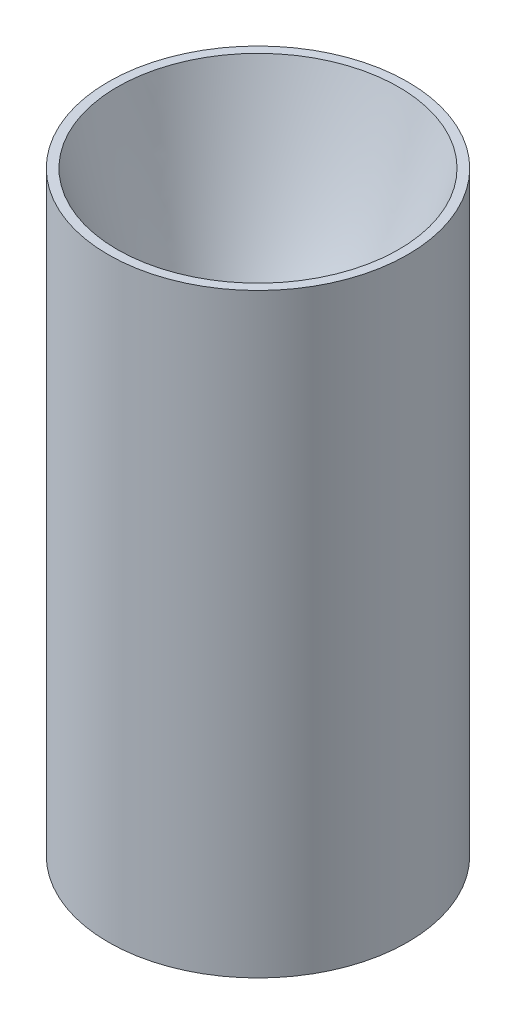
ISO-10303-21;
HEADER;
FILE_DESCRIPTION(('STEP AP214'),'2;1');
FILE_NAME('part.step','',(''),(''),'','','');
FILE_SCHEMA(('AUTOMOTIVE_DESIGN { 1 0 10303 214 1 1 1 1 }'));
ENDSEC;
DATA;
#1=APPLICATION_CONTEXT('core data for automotive mechanical design processes');
#2=APPLICATION_PROTOCOL_DEFINITION('international standard','automotive_design',2000,#1);
#3=PRODUCT_CONTEXT('',#1,'mechanical');
#4=PRODUCT('Part','Part','',(#3));
#5=PRODUCT_RELATED_PRODUCT_CATEGORY('part','',(#4));
#6=PRODUCT_DEFINITION_FORMATION('','',#4);
#7=PRODUCT_DEFINITION_CONTEXT('part definition',#1,'design');
#8=PRODUCT_DEFINITION('design','',#6,#7);
#9=PRODUCT_DEFINITION_SHAPE('','',#8);
#10=(LENGTH_UNIT() NAMED_UNIT(*) SI_UNIT(.MILLI.,.METRE.));
#11=(NAMED_UNIT(*) PLANE_ANGLE_UNIT() SI_UNIT($,.RADIAN.));
#12=(NAMED_UNIT(*) SI_UNIT($,.STERADIAN.) SOLID_ANGLE_UNIT());
#13=UNCERTAINTY_MEASURE_WITH_UNIT(LENGTH_MEASURE(1.E-05),#10,'distance_accuracy_value','');
#14=(GEOMETRIC_REPRESENTATION_CONTEXT(3) GLOBAL_UNCERTAINTY_ASSIGNED_CONTEXT((#13)) GLOBAL_UNIT_ASSIGNED_CONTEXT((#10,
#11,#12)) REPRESENTATION_CONTEXT('',''));
#15=CARTESIAN_POINT('',(0.,0.,0.));
#16=DIRECTION('',(0.,0.,1.));
#17=DIRECTION('',(1.,0.,0.));
#18=AXIS2_PLACEMENT_3D('',#15,#16,#17);
#19=CARTESIAN_POINT('',(26.7062113287053,6.50923965033825,0.));
#20=CARTESIAN_POINT('',(26.6554523867853,6.45847884124841,0.));
#21=CARTESIAN_POINT('',(26.5813741961518,6.38212177902064,0.));
#22=CARTESIAN_POINT('',(26.4154873738352,6.20864164611654,0.));
#23=CARTESIAN_POINT('',(26.2772778817675,6.04995163656635,0.));
#24=CARTESIAN_POINT('',(26.089808500155,5.83291364729743,0.));
#25=CARTESIAN_POINT('',(25.9153376003489,5.61072754276574,0.));
#26=CARTESIAN_POINT('',(25.7027203959471,5.32551893593357,0.));
#27=CARTESIAN_POINT('',(25.5134468469557,5.04570386122365,0.));
#28=CARTESIAN_POINT('',(25.3274206305271,4.75130157548285,0.));
#29=CARTESIAN_POINT('',(25.1569443484507,4.45478312275658,0.));
#30=CARTESIAN_POINT('',(24.995002426509,4.14928218433454,0.));
#31=CARTESIAN_POINT('',(24.8462181027666,3.83966673272222,0.));
#32=CARTESIAN_POINT('',(24.7081288971286,3.52362715719563,0.));
#33=CARTESIAN_POINT('',(24.5825511965105,3.20334704099946,0.));
#34=CARTESIAN_POINT('',(24.4686735390696,2.87809264472723,0.));
#35=CARTESIAN_POINT('',(24.3672556972351,2.54923942069524,0.));
#36=CARTESIAN_POINT('',(24.2780737272776,2.21635441997579,0.));
#37=CARTESIAN_POINT('',(24.2014758273978,1.88099677694374,0.));
#38=CARTESIAN_POINT('',(24.1374314313173,1.54205049780854,0.));
#39=CARTESIAN_POINT('',(24.0861168447955,1.20253727286862,0.));
#40=CARTESIAN_POINT('',(24.0523672130417,0.901433327840423,0.));
#41=CARTESIAN_POINT('',(24.0314657247247,0.646764266269616,0.));
#42=CARTESIAN_POINT('',(24.0193936938296,0.427064117093707,0.));
#43=CARTESIAN_POINT('',(24.0129558487222,0.267641069384235,0.));
#44=CARTESIAN_POINT('',(24.0105384573959,0.11011368951911,0.));
#45=CARTESIAN_POINT('',(24.0100006264442,0.0358926521759333,0.));
#46=CARTESIAN_POINT('',(24.01,1.20494413205813E-13,0.));
#47=B_SPLINE_CURVE_WITH_KNOTS('',4,(#19,#20,#21,#22,#23,#24,#25,#26,#27,#28,#29,#30,#31,#32,#33,
#34,#35,#36,#37,#38,#39,#40,#41,#42,#43,#44,#45,#46),.UNSPECIFIED.,.F.,.F.,(5,1,1,1,1,1,1,1,1,1,
1,1,1,1,1,1,1,1,1,1,1,1,1,1,5),(0.0825688161645696,0.122284452541055,0.142142270729318,
0.162000088917581,0.201715725294151,0.241431361670644,0.281146998047181,0.320862634423759,
0.360578270800262,0.400293907176806,0.440009543553384,0.479725179929891,0.519440816306429,
0.55915645268299,0.598872089059496,0.638587725436031,0.678303361812587,0.718018998189109,
0.75773463456565,0.797450270942201,0.837165907318734,0.857023725507005,0.876881543695275,
0.896739361883545,0.916597180071815),.UNSPECIFIED.);
#48=CARTESIAN_POINT('',(0.,0.,0.));
#49=DIRECTION('',(0.,1.,0.));
#50=AXIS1_PLACEMENT('',#48,#49);
#51=SURFACE_OF_REVOLUTION('',#47,#50);
#52=CARTESIAN_POINT('',(0.,-4.63851297595377E-09,0.));
#53=DIRECTION('',(0.,1.,0.));
#54=DIRECTION('',(0.,0.,1.));
#55=AXIS2_PLACEMENT_3D('',#52,#53,#54);
#56=CIRCLE('',#55,24.0100000000001);
#57=CARTESIAN_POINT('',(0.,-4.63851297595377E-09,24.0100000000001));
#58=VERTEX_POINT('',#57);
#59=EDGE_CURVE('E12',#58,#58,#56,.T.);
#60=ORIENTED_EDGE('',*,*,#59,.F.);
#61=EDGE_LOOP('',(#60));
#62=FACE_BOUND('',#61,.T.);
#63=CARTESIAN_POINT('',(0.,6.50923965033824,0.));
#64=DIRECTION('',(0.,1.,0.));
#65=DIRECTION('',(0.,0.,1.));
#66=AXIS2_PLACEMENT_3D('',#63,#64,#65);
#67=CIRCLE('',#66,26.7062113287053);
#68=CARTESIAN_POINT('',(0.,6.50923965033824,26.7062113287053));
#69=VERTEX_POINT('',#68);
#70=EDGE_CURVE('E132',#69,#69,#67,.T.);
#71=ORIENTED_EDGE('',*,*,#70,.T.);
#72=EDGE_LOOP('',(#71));
#73=FACE_BOUND('',#72,.T.);
#74=ADVANCED_FACE('F40',(#62,#73),#51,.T.);
#75=CARTESIAN_POINT('',(24.0100000000001,-4.63851297595377E-09,0.));
#76=CARTESIAN_POINT('',(24.0100012308879,-0.0705286471806296,0.));
#77=CARTESIAN_POINT('',(24.0105303784154,-0.213584189808399,0.));
#78=CARTESIAN_POINT('',(24.0129060644378,-0.543182916000295,0.));
#79=CARTESIAN_POINT('',(24.0192304593338,-0.824160396722382,0.));
#80=CARTESIAN_POINT('',(24.028715581354,-1.19482207162053,0.));
#81=CARTESIAN_POINT('',(24.041357874975,-1.5134350582044,0.));
#82=CARTESIAN_POINT('',(24.0571580997589,-1.86193960310249,0.));
#83=CARTESIAN_POINT('',(24.0761133590991,-2.19370687162018,0.));
#84=CARTESIAN_POINT('',(24.1037509743088,-2.6180693997322,0.));
#85=CARTESIAN_POINT('',(24.1432191823018,-3.12203394660472,0.));
#86=CARTESIAN_POINT('',(24.2142318445419,-3.87997867467877,0.));
#87=CARTESIAN_POINT('',(24.3340588184502,-4.88645038788512,0.));
#88=CARTESIAN_POINT('',(24.5104181877973,-6.05671075995822,0.));
#89=CARTESIAN_POINT('',(24.7618173808534,-7.38516641426055,0.));
#90=CARTESIAN_POINT('',(25.0627274651943,-8.70357451376833,0.));
#91=CARTESIAN_POINT('',(25.4127027791712,-10.0096372076367,0.));
#92=CARTESIAN_POINT('',(25.8112931431577,-11.3018195954144,0.));
#93=CARTESIAN_POINT('',(26.2578775553251,-12.578099333351,0.));
#94=CARTESIAN_POINT('',(26.7519354900863,-13.8368874820531,0.));
#95=CARTESIAN_POINT('',(27.2926052929641,-15.0761971264614,0.));
#96=CARTESIAN_POINT('',(27.8794115613683,-16.2946097910276,0.));
#97=CARTESIAN_POINT('',(28.5110715760484,-17.4899387906979,0.));
#98=CARTESIAN_POINT('',(29.1874645778211,-18.6612877533156,0.));
#99=CARTESIAN_POINT('',(29.9063772872839,-19.8057433922576,0.));
#100=CARTESIAN_POINT('',(30.6689541882257,-20.9238600699861,0.));
#101=CARTESIAN_POINT('',(31.3700993843039,-21.8744117549958,0.));
#102=CARTESIAN_POINT('',(31.9996683170955,-22.6734454747528,0.));
#103=CARTESIAN_POINT('',(32.5350606124484,-23.3204221321394,0.));
#104=CARTESIAN_POINT('',(32.9831879656876,-23.8400050101016,0.));
#105=CARTESIAN_POINT('',(33.4193822252076,-24.3298162395294,0.));
#106=CARTESIAN_POINT('',(33.846758321774,-24.7884843827885,0.));
#107=CARTESIAN_POINT('',(34.1564908411792,-25.1138683029968,0.));
#108=CARTESIAN_POINT('',(34.447792159871,-25.4096490394163,0.));
#109=CARTESIAN_POINT('',(34.547344628126,-25.5099499246291,0.));
#110=CARTESIAN_POINT('',(34.5972150059849,-25.5598221095879,0.));
#111=B_SPLINE_CURVE_WITH_KNOTS('',4,(#75,#76,#77,#78,#79,#80,#81,#82,#83,#84,#85,#86,#87,#88,
#89,#90,#91,#92,#93,#94,#95,#96,#97,#98,#99,#100,#101,#102,#103,#104,#105,#106,#107,#108,#109,
#110),.UNSPECIFIED.,.F.,.F.,(5,1,1,1,1,1,1,1,1,1,1,1,1,1,1,1,1,1,1,1,1,1,1,1,1,1,1,1,1,1,1,1,5),
(0.0826377293539222,0.0925749264345495,0.10251212335078,0.11244932026701,0.122386517183241,
0.132323714099471,0.142260911015702,0.152198107931932,0.162135304848163,0.182009698680624,
0.201884092513085,0.241632880178006,0.281381667842927,0.321130455507848,0.360879243172768,
0.400628030837689,0.44037681850261,0.480125606167531,0.519874393832452,0.559623181497373,
0.599371969162294,0.639120756827214,0.678869544492136,0.718618332157059,0.758367119821983,
0.798115907486907,0.817990301319368,0.837864695151829,0.857739088984291,0.877613482816753,
0.897487876649217,0.907425073565449,0.91736227031499),.UNSPECIFIED.);
#112=CARTESIAN_POINT('',(0.,0.,0.));
#113=DIRECTION('',(0.,1.,0.));
#114=AXIS1_PLACEMENT('',#112,#113);
#115=SURFACE_OF_REVOLUTION('',#111,#114);
#116=CARTESIAN_POINT('',(0.,-25.5598221063175,0.));
#117=DIRECTION('',(0.,1.,0.));
#118=DIRECTION('',(0.,0.,1.));
#119=AXIS2_PLACEMENT_3D('',#116,#117,#118);
#120=CIRCLE('',#119,34.597215002682);
#121=CARTESIAN_POINT('',(0.,-25.5598221063175,34.597215002682));
#122=VERTEX_POINT('',#121);
#123=EDGE_CURVE('E49',#122,#122,#120,.T.);
#124=ORIENTED_EDGE('',*,*,#123,.F.);
#125=EDGE_LOOP('',(#124));
#126=FACE_BOUND('',#125,.T.);
#127=ORIENTED_EDGE('',*,*,#59,.T.);
#128=EDGE_LOOP('',(#127));
#129=FACE_BOUND('',#128,.T.);
#130=ADVANCED_FACE('F146',(#126,#129),#115,.T.);
#131=CARTESIAN_POINT('',(0.,-25.5598221063175,0.));
#132=DIRECTION('',(0.,-1.,0.));
#133=DIRECTION('',(0.,0.,-1.));
#134=AXIS2_PLACEMENT_3D('',#131,#132,#133);
#135=CONICAL_SURFACE('',#134,34.597215002682,0.785398163436918);
#136=CARTESIAN_POINT('',(0.,-34.1674502939677,0.));
#137=DIRECTION('',(0.,1.,0.));
#138=DIRECTION('',(0.,0.,1.));
#139=AXIS2_PLACEMENT_3D('',#136,#137,#138);
#140=CIRCLE('',#139,43.2048431910117);
#141=CARTESIAN_POINT('',(0.,-34.1674502939677,43.2048431910117));
#142=VERTEX_POINT('',#141);
#143=EDGE_CURVE('E209',#142,#142,#140,.T.);
#144=ORIENTED_EDGE('',*,*,#143,.F.);
#145=EDGE_LOOP('',(#144));
#146=FACE_BOUND('',#145,.T.);
#147=ORIENTED_EDGE('',*,*,#123,.T.);
#148=EDGE_LOOP('',(#147));
#149=FACE_BOUND('',#148,.T.);
#150=ADVANCED_FACE('F150',(#146,#149),#135,.F.);
#151=CARTESIAN_POINT('',(43.2048431910117,-34.1674502939677,0.));
#152=CARTESIAN_POINT('',(43.2547153506856,-34.2173226920675,0.));
#153=CARTESIAN_POINT('',(43.355324273446,-34.3186769232247,0.));
#154=CARTESIAN_POINT('',(43.5850046103254,-34.5517100833776,0.));
#155=CARTESIAN_POINT('',(43.7848568308025,-34.7605007810703,0.));
#156=CARTESIAN_POINT('',(44.0923897137163,-35.0847918110198,0.));
#157=CARTESIAN_POINT('',(44.4257084053366,-35.4471532786684,0.));
#158=CARTESIAN_POINT('',(44.8260591696382,-35.8944082488335,0.));
#159=CARTESIAN_POINT('',(45.2637499086886,-36.4035418925499,0.));
#160=CARTESIAN_POINT('',(45.804470174004,-37.0558327258508,0.));
#161=CARTESIAN_POINT('',(46.4308013075469,-37.8516123801807,0.));
#162=CARTESIAN_POINT('',(47.1340343977234,-38.8042368249593,0.));
#163=CARTESIAN_POINT('',(47.8954077940367,-39.9211332329875,0.));
#164=CARTESIAN_POINT('',(48.6150575182791,-41.066315445318,0.));
#165=CARTESIAN_POINT('',(49.2910525354159,-42.2372537964432,0.));
#166=CARTESIAN_POINT('',(49.9229932483287,-43.432862075061,0.));
#167=CARTESIAN_POINT('',(50.5096660891853,-44.6511293450361,0.));
#168=CARTESIAN_POINT('',(51.0504527138448,-45.8905689397382,0.));
#169=CARTESIAN_POINT('',(51.5444702004237,-47.1492955949499,0.));
#170=CARTESIAN_POINT('',(51.935281123378,-48.266129746359,0.));
#171=CARTESIAN_POINT('',(52.2402217371782,-49.2332382589145,0.));
#172=CARTESIAN_POINT('',(52.5209466340237,-50.2076495532163,0.));
#173=CARTESIAN_POINT('',(52.777307542888,-51.1886995950363,0.));
#174=CARTESIAN_POINT('',(53.002996622536,-52.1776033299981,0.));
#175=CARTESIAN_POINT('',(53.1977432709239,-53.1725857458987,0.));
#176=CARTESIAN_POINT('',(53.3676082482091,-54.1725959341046,0.));
#177=CARTESIAN_POINT('',(53.4883593342665,-55.0083263626577,0.));
#178=CARTESIAN_POINT('',(53.5882209356748,-55.8486408667646,0.));
#179=CARTESIAN_POINT('',(53.6671256164262,-56.6881586650867,0.));
#180=CARTESIAN_POINT('',(53.7113377874485,-57.2811203984697,0.));
#181=CARTESIAN_POINT('',(53.7413501349951,-57.7817549415905,0.));
#182=CARTESIAN_POINT('',(53.7611009684533,-58.2129981204124,0.));
#183=CARTESIAN_POINT('',(53.7737438702188,-58.5327279861784,0.));
#184=CARTESIAN_POINT('',(53.7832293621914,-58.9049559910443,0.));
#185=CARTESIAN_POINT('',(53.7895539646928,-59.1817251147379,0.));
#186=CARTESIAN_POINT('',(53.7919298193635,-59.5155666011774,0.));
#187=CARTESIAN_POINT('',(53.7924589641933,-59.6571436548259,0.));
#188=CARTESIAN_POINT('',(53.7924601964689,-59.7276737080035,0.));
#189=B_SPLINE_CURVE_WITH_KNOTS('',4,(#151,#152,#153,#154,#155,#156,#157,#158,#159,#160,#161,
#162,#163,#164,#165,#166,#167,#168,#169,#170,#171,#172,#173,#174,#175,#176,#177,#178,#179,#180,
#181,#182,#183,#184,#185,#186,#187,#188),.UNSPECIFIED.,.F.,.F.,(5,1,1,1,1,1,1,1,1,1,1,1,1,1,1,1,
1,1,1,1,1,1,1,1,1,1,1,1,1,1,1,1,1,1,5),(0.0826377289155871,0.0925749252335792,0.102512122149811,
0.112449319066044,0.122386515982276,0.142260909814737,0.162135303647198,0.182009697479659,
0.201884091312119,0.241632878977041,0.281381666641963,0.321130454306884,0.360879241971805,
0.400628029636727,0.440376817301649,0.480125604966571,0.519874392631492,0.559623180296412,
0.599371967961334,0.619246361793795,0.639120755626256,0.678869543291178,0.718618330956099,
0.73849272478856,0.758367118621021,0.798115906285942,0.817990300118403,0.837864693950863,
0.857739087783324,0.867676284699555,0.877613481615785,0.887550678532016,0.897487875448246,
0.907425072364477,0.917362269883437),.UNSPECIFIED.);
#190=CARTESIAN_POINT('',(0.,0.,0.));
#191=DIRECTION('',(0.,1.,0.));
#192=AXIS1_PLACEMENT('',#190,#191);
#193=SURFACE_OF_REVOLUTION('',#189,#192);
#194=CARTESIAN_POINT('',(0.,-59.7276737250069,0.));
#195=DIRECTION('',(0.,1.,0.));
#196=DIRECTION('',(0.,0.,1.));
#197=AXIS2_PLACEMENT_3D('',#194,#195,#196);
#198=CIRCLE('',#197,53.7924601964692);
#199=CARTESIAN_POINT('',(0.,-59.7276737250069,53.7924601964692));
#200=VERTEX_POINT('',#199);
#201=EDGE_CURVE('E203',#200,#200,#198,.T.);
#202=ORIENTED_EDGE('',*,*,#201,.F.);
#203=EDGE_LOOP('',(#202));
#204=FACE_BOUND('',#203,.T.);
#205=ORIENTED_EDGE('',*,*,#143,.T.);
#206=EDGE_LOOP('',(#205));
#207=FACE_BOUND('',#206,.T.);
#208=ADVANCED_FACE('F154',(#204,#207),#193,.T.);
#209=CARTESIAN_POINT('',(0.,0.,0.));
#210=DIRECTION('',(0.,1.,0.));
#211=DIRECTION('',(0.,0.,1.));
#212=AXIS2_PLACEMENT_3D('',#209,#210,#211);
#213=CYLINDRICAL_SURFACE('',#212,53.7924601964692);
#214=CARTESIAN_POINT('',(0.,-193.077673725007,0.));
#215=DIRECTION('',(0.,1.,0.));
#216=DIRECTION('',(0.,0.,1.));
#217=AXIS2_PLACEMENT_3D('',#214,#215,#216);
#218=CIRCLE('',#217,53.7924601964692);
#219=CARTESIAN_POINT('',(0.,-193.077673725007,53.7924601964692));
#220=VERTEX_POINT('',#219);
#221=EDGE_CURVE('E44',#220,#220,#218,.T.);
#222=ORIENTED_EDGE('',*,*,#221,.F.);
#223=EDGE_LOOP('',(#222));
#224=FACE_BOUND('',#223,.T.);
#225=ORIENTED_EDGE('',*,*,#201,.T.);
#226=EDGE_LOOP('',(#225));
#227=FACE_BOUND('',#226,.T.);
#228=ADVANCED_FACE('F158',(#224,#227),#213,.F.);
#229=CARTESIAN_POINT('',(76.2,-193.077673725007,0.));
#230=DIRECTION('',(0.,1.,0.));
#231=DIRECTION('',(0.,0.,1.));
#232=AXIS2_PLACEMENT_3D('',#229,#230,#231);
#233=PLANE('',#232);
#234=CARTESIAN_POINT('',(47.1463446356136,-193.077673725007,47.1463446356125));
#235=DIRECTION('',(0.,-1.,0.));
#236=DIRECTION('',(0.,0.,-1.));
#237=AXIS2_PLACEMENT_3D('',#234,#235,#236);
#238=CIRCLE('',#237,4.21639999999999);
#239=CARTESIAN_POINT('',(47.1463446356136,-193.077673725007,42.9299446356125));
#240=VERTEX_POINT('',#239);
#241=EDGE_CURVE('E86',#240,#240,#238,.T.);
#242=ORIENTED_EDGE('',*,*,#241,.F.);
#243=EDGE_LOOP('',(#242));
#244=FACE_BOUND('',#243,.T.);
#245=CARTESIAN_POINT('',(6.98383554802098E-13,-193.077673725007,66.675));
#246=DIRECTION('',(0.,-1.,0.));
#247=DIRECTION('',(0.,0.,-1.));
#248=AXIS2_PLACEMENT_3D('',#245,#246,#247);
#249=CIRCLE('',#248,4.21639999999999);
#250=CARTESIAN_POINT('',(6.98383554802098E-13,-193.077673725007,62.4586));
#251=VERTEX_POINT('',#250);
#252=EDGE_CURVE('E85',#251,#251,#249,.T.);
#253=ORIENTED_EDGE('',*,*,#252,.F.);
#254=EDGE_LOOP('',(#253));
#255=FACE_BOUND('',#254,.T.);
#256=CARTESIAN_POINT('',(-47.1463446356126,-193.077673725007,47.1463446356135));
#257=DIRECTION('',(0.,-1.,0.));
#258=DIRECTION('',(0.,0.,-1.));
#259=AXIS2_PLACEMENT_3D('',#256,#257,#258);
#260=CIRCLE('',#259,4.21639999999999);
#261=CARTESIAN_POINT('',(-47.1463446356126,-193.077673725007,42.9299446356135));
#262=VERTEX_POINT('',#261);
#263=EDGE_CURVE('E96',#262,#262,#260,.T.);
#264=ORIENTED_EDGE('',*,*,#263,.F.);
#265=EDGE_LOOP('',(#264));
#266=FACE_BOUND('',#265,.T.);
#267=CARTESIAN_POINT('',(-66.675,-193.077673725007,0.));
#268=DIRECTION('',(0.,-1.,0.));
#269=DIRECTION('',(0.,0.,-1.));
#270=AXIS2_PLACEMENT_3D('',#267,#268,#269);
#271=CIRCLE('',#270,4.21639999999999);
#272=CARTESIAN_POINT('',(-66.675,-193.077673725007,-4.21639999999999));
#273=VERTEX_POINT('',#272);
#274=EDGE_CURVE('E102',#273,#273,#271,.T.);
#275=ORIENTED_EDGE('',*,*,#274,.F.);
#276=EDGE_LOOP('',(#275));
#277=FACE_BOUND('',#276,.T.);
#278=CARTESIAN_POINT('',(-47.1463446356133,-193.077673725007,-47.1463446356128));
#279=DIRECTION('',(0.,-1.,0.));
#280=DIRECTION('',(0.,0.,-1.));
#281=AXIS2_PLACEMENT_3D('',#278,#279,#280);
#282=CIRCLE('',#281,4.21639999999999);
#283=CARTESIAN_POINT('',(-47.1463446356133,-193.077673725007,-51.3627446356128));
#284=VERTEX_POINT('',#283);
#285=EDGE_CURVE('E108',#284,#284,#282,.T.);
#286=ORIENTED_EDGE('',*,*,#285,.F.);
#287=EDGE_LOOP('',(#286));
#288=FACE_BOUND('',#287,.T.);
#289=CARTESIAN_POINT('',(-2.32794518267366E-13,-193.077673725007,-66.675));
#290=DIRECTION('',(0.,-1.,0.));
#291=DIRECTION('',(0.,0.,-1.));
#292=AXIS2_PLACEMENT_3D('',#289,#290,#291);
#293=CIRCLE('',#292,4.21639999999999);
#294=CARTESIAN_POINT('',(-2.32794518267366E-13,-193.077673725007,-70.8914));
#295=VERTEX_POINT('',#294);
#296=EDGE_CURVE('E114',#295,#295,#293,.T.);
#297=ORIENTED_EDGE('',*,*,#296,.F.);
#298=EDGE_LOOP('',(#297));
#299=FACE_BOUND('',#298,.T.);
#300=CARTESIAN_POINT('',(47.146344635613,-193.077673725007,-47.1463446356132));
#301=DIRECTION('',(0.,-1.,0.));
#302=DIRECTION('',(0.,0.,-1.));
#303=AXIS2_PLACEMENT_3D('',#300,#301,#302);
#304=CIRCLE('',#303,4.21639999999999);
#305=CARTESIAN_POINT('',(47.146344635613,-193.077673725007,-51.3627446356131));
#306=VERTEX_POINT('',#305);
#307=EDGE_CURVE('E120',#306,#306,#304,.T.);
#308=ORIENTED_EDGE('',*,*,#307,.F.);
#309=EDGE_LOOP('',(#308));
#310=FACE_BOUND('',#309,.T.);
#311=CARTESIAN_POINT('',(66.675,-193.077673725007,0.));
#312=DIRECTION('',(0.,-1.,0.));
#313=DIRECTION('',(0.,0.,-1.));
#314=AXIS2_PLACEMENT_3D('',#311,#312,#313);
#315=CIRCLE('',#314,4.21639999999999);
#316=CARTESIAN_POINT('',(66.675,-193.077673725007,-4.21639999999999));
#317=VERTEX_POINT('',#316);
#318=EDGE_CURVE('E126',#317,#317,#315,.T.);
#319=ORIENTED_EDGE('',*,*,#318,.F.);
#320=EDGE_LOOP('',(#319));
#321=FACE_BOUND('',#320,.T.);
#322=CARTESIAN_POINT('',(0.,-193.077673725007,0.));
#323=DIRECTION('',(0.,1.,0.));
#324=DIRECTION('',(0.,0.,1.));
#325=AXIS2_PLACEMENT_3D('',#322,#323,#324);
#326=CIRCLE('',#325,76.2);
#327=CARTESIAN_POINT('',(0.,-193.077673725007,76.2));
#328=VERTEX_POINT('',#327);
#329=EDGE_CURVE('E200',#328,#328,#326,.T.);
#330=ORIENTED_EDGE('',*,*,#329,.F.);
#331=EDGE_LOOP('',(#330));
#332=FACE_BOUND('',#331,.T.);
#333=ORIENTED_EDGE('',*,*,#221,.T.);
#334=EDGE_LOOP('',(#333));
#335=FACE_BOUND('',#334,.T.);
#336=ADVANCED_FACE('F42',(#244,#255,#266,#277,#288,#299,#310,#321,#332,#335),#233,.F.);
#337=CARTESIAN_POINT('',(0.,0.,0.));
#338=DIRECTION('',(0.,1.,0.));
#339=DIRECTION('',(0.,0.,1.));
#340=AXIS2_PLACEMENT_3D('',#337,#338,#339);
#341=CYLINDRICAL_SURFACE('',#340,76.2);
#342=CARTESIAN_POINT('',(0.,109.927347076635,0.));
#343=DIRECTION('',(0.,1.,0.));
#344=DIRECTION('',(0.,0.,1.));
#345=AXIS2_PLACEMENT_3D('',#342,#343,#344);
#346=CIRCLE('',#345,76.2);
#347=CARTESIAN_POINT('',(0.,109.927347076635,76.2));
#348=VERTEX_POINT('',#347);
#349=EDGE_CURVE('E197',#348,#348,#346,.T.);
#350=ORIENTED_EDGE('',*,*,#349,.F.);
#351=EDGE_LOOP('',(#350));
#352=FACE_BOUND('',#351,.T.);
#353=ORIENTED_EDGE('',*,*,#329,.T.);
#354=EDGE_LOOP('',(#353));
#355=FACE_BOUND('',#354,.T.);
#356=ADVANCED_FACE('F186',(#352,#355),#341,.T.);
#357=CARTESIAN_POINT('',(71.6384554787615,109.927347076635,0.));
#358=DIRECTION('',(0.,-1.,0.));
#359=DIRECTION('',(0.,0.,-1.));
#360=AXIS2_PLACEMENT_3D('',#357,#358,#359);
#361=PLANE('',#360);
#362=CARTESIAN_POINT('',(0.,109.927347076635,0.));
#363=DIRECTION('',(0.,1.,0.));
#364=DIRECTION('',(0.,0.,1.));
#365=AXIS2_PLACEMENT_3D('',#362,#363,#364);
#366=CIRCLE('',#365,71.6384554787615);
#367=CARTESIAN_POINT('',(0.,109.927347076635,71.6384554787615));
#368=VERTEX_POINT('',#367);
#369=EDGE_CURVE('E204',#368,#368,#366,.T.);
#370=ORIENTED_EDGE('',*,*,#369,.F.);
#371=EDGE_LOOP('',(#370));
#372=FACE_BOUND('',#371,.T.);
#373=ORIENTED_EDGE('',*,*,#349,.T.);
#374=EDGE_LOOP('',(#373));
#375=FACE_BOUND('',#374,.T.);
#376=ADVANCED_FACE('F182',(#372,#375),#361,.F.);
#377=CARTESIAN_POINT('',(71.6384554787615,109.927347076635,0.));
#378=CARTESIAN_POINT('',(49.1723334607279,34.6359542236987,0.));
#379=CARTESIAN_POINT('',(26.7062113287053,6.50923965033824,0.));
#380=B_SPLINE_CURVE_WITH_KNOTS('',2,(#377,#378,#379),.UNSPECIFIED.,.F.,.F.,(3,3),(0.,1.),.UNSPECIFIED.);
#381=CARTESIAN_POINT('',(0.,0.,0.));
#382=DIRECTION('',(0.,1.,0.));
#383=AXIS1_PLACEMENT('',#381,#382);
#384=SURFACE_OF_REVOLUTION('',#380,#383);
#385=ORIENTED_EDGE('',*,*,#70,.F.);
#386=EDGE_LOOP('',(#385));
#387=FACE_BOUND('',#386,.T.);
#388=ORIENTED_EDGE('',*,*,#369,.T.);
#389=EDGE_LOOP('',(#388));
#390=FACE_BOUND('',#389,.T.);
#391=ADVANCED_FACE('F177',(#387,#390),#384,.T.);
#392=CARTESIAN_POINT('',(66.675,-168.076453725007,0.));
#393=DIRECTION('',(0.,-1.,0.));
#394=DIRECTION('',(0.,0.,-1.));
#395=AXIS2_PLACEMENT_3D('',#392,#393,#394);
#396=CONICAL_SURFACE('',#395,4.21639999999999,1.02974425867665);
#397=CARTESIAN_POINT('',(66.675,-165.542985010939,0.));
#398=VERTEX_POINT('',#397);
#399=VERTEX_LOOP('',#398);
#400=FACE_BOUND('',#399,.T.);
#401=CARTESIAN_POINT('',(66.675,-168.076453725007,0.));
#402=DIRECTION('',(0.,-1.,0.));
#403=DIRECTION('',(0.,0.,-1.));
#404=AXIS2_PLACEMENT_3D('',#401,#402,#403);
#405=CIRCLE('',#404,4.21639999999999);
#406=CARTESIAN_POINT('',(66.675,-168.076453725007,-4.21639999999999));
#407=VERTEX_POINT('',#406);
#408=EDGE_CURVE('E129',#407,#407,#405,.T.);
#409=ORIENTED_EDGE('',*,*,#408,.T.);
#410=EDGE_LOOP('',(#409));
#411=FACE_BOUND('',#410,.T.);
#412=ADVANCED_FACE('F181',(#400,#411),#396,.F.);
#413=CARTESIAN_POINT('',(66.675,-193.077673725007,0.));
#414=DIRECTION('',(0.,-1.,0.));
#415=DIRECTION('',(0.,0.,-1.));
#416=AXIS2_PLACEMENT_3D('',#413,#414,#415);
#417=CYLINDRICAL_SURFACE('',#416,4.21639999999999);
#418=ORIENTED_EDGE('',*,*,#408,.F.);
#419=EDGE_LOOP('',(#418));
#420=FACE_BOUND('',#419,.T.);
#421=ORIENTED_EDGE('',*,*,#318,.T.);
#422=EDGE_LOOP('',(#421));
#423=FACE_BOUND('',#422,.T.);
#424=ADVANCED_FACE('F249',(#420,#423),#417,.F.);
#425=CARTESIAN_POINT('',(47.146344635613,-168.076453725007,-47.1463446356132));
#426=DIRECTION('',(0.,-1.,0.));
#427=DIRECTION('',(0.,0.,-1.));
#428=AXIS2_PLACEMENT_3D('',#425,#426,#427);
#429=CONICAL_SURFACE('',#428,4.21639999999999,1.02974425867665);
#430=CARTESIAN_POINT('',(47.146344635613,-165.542985010939,-47.1463446356132));
#431=VERTEX_POINT('',#430);
#432=VERTEX_LOOP('',#431);
#433=FACE_BOUND('',#432,.T.);
#434=CARTESIAN_POINT('',(47.146344635613,-168.076453725007,-47.1463446356132));
#435=DIRECTION('',(0.,-1.,0.));
#436=DIRECTION('',(0.,0.,-1.));
#437=AXIS2_PLACEMENT_3D('',#434,#435,#436);
#438=CIRCLE('',#437,4.21639999999999);
#439=CARTESIAN_POINT('',(47.146344635613,-168.076453725007,-51.3627446356131));
#440=VERTEX_POINT('',#439);
#441=EDGE_CURVE('E123',#440,#440,#438,.T.);
#442=ORIENTED_EDGE('',*,*,#441,.T.);
#443=EDGE_LOOP('',(#442));
#444=FACE_BOUND('',#443,.T.);
#445=ADVANCED_FACE('F254',(#433,#444),#429,.F.);
#446=CARTESIAN_POINT('',(47.146344635613,-193.077673725007,-47.1463446356132));
#447=DIRECTION('',(0.,-1.,0.));
#448=DIRECTION('',(0.,0.,-1.));
#449=AXIS2_PLACEMENT_3D('',#446,#447,#448);
#450=CYLINDRICAL_SURFACE('',#449,4.21639999999999);
#451=ORIENTED_EDGE('',*,*,#441,.F.);
#452=EDGE_LOOP('',(#451));
#453=FACE_BOUND('',#452,.T.);
#454=ORIENTED_EDGE('',*,*,#307,.T.);
#455=EDGE_LOOP('',(#454));
#456=FACE_BOUND('',#455,.T.);
#457=ADVANCED_FACE('F259',(#453,#456),#450,.F.);
#458=CARTESIAN_POINT('',(-2.32794518267366E-13,-168.076453725007,-66.675));
#459=DIRECTION('',(0.,-1.,0.));
#460=DIRECTION('',(0.,0.,-1.));
#461=AXIS2_PLACEMENT_3D('',#458,#459,#460);
#462=CONICAL_SURFACE('',#461,4.21639999999999,1.02974425867665);
#463=CARTESIAN_POINT('',(-2.39538571947206E-13,-165.542985010939,-66.675));
#464=VERTEX_POINT('',#463);
#465=VERTEX_LOOP('',#464);
#466=FACE_BOUND('',#465,.T.);
#467=CARTESIAN_POINT('',(-2.32794518267366E-13,-168.076453725007,-66.675));
#468=DIRECTION('',(0.,-1.,0.));
#469=DIRECTION('',(0.,0.,-1.));
#470=AXIS2_PLACEMENT_3D('',#467,#468,#469);
#471=CIRCLE('',#470,4.21639999999999);
#472=CARTESIAN_POINT('',(-2.32794518267366E-13,-168.076453725007,-70.8914));
#473=VERTEX_POINT('',#472);
#474=EDGE_CURVE('E117',#473,#473,#471,.T.);
#475=ORIENTED_EDGE('',*,*,#474,.T.);
#476=EDGE_LOOP('',(#475));
#477=FACE_BOUND('',#476,.T.);
#478=ADVANCED_FACE('F270',(#466,#477),#462,.F.);
#479=CARTESIAN_POINT('',(-2.32794518267366E-13,-193.077673725007,-66.675));
#480=DIRECTION('',(0.,-1.,0.));
#481=DIRECTION('',(0.,0.,-1.));
#482=AXIS2_PLACEMENT_3D('',#479,#480,#481);
#483=CYLINDRICAL_SURFACE('',#482,4.21639999999999);
#484=ORIENTED_EDGE('',*,*,#474,.F.);
#485=EDGE_LOOP('',(#484));
#486=FACE_BOUND('',#485,.T.);
#487=ORIENTED_EDGE('',*,*,#296,.T.);
#488=EDGE_LOOP('',(#487));
#489=FACE_BOUND('',#488,.T.);
#490=ADVANCED_FACE('F282',(#486,#489),#483,.F.);
#491=CARTESIAN_POINT('',(-47.1463446356133,-168.076453725007,-47.1463446356128));
#492=DIRECTION('',(0.,-1.,0.));
#493=DIRECTION('',(0.,0.,-1.));
#494=AXIS2_PLACEMENT_3D('',#491,#492,#493);
#495=CONICAL_SURFACE('',#494,4.21639999999999,1.02974425867665);
#496=CARTESIAN_POINT('',(-47.1463446356133,-165.542985010939,-47.1463446356128));
#497=VERTEX_POINT('',#496);
#498=VERTEX_LOOP('',#497);
#499=FACE_BOUND('',#498,.T.);
#500=CARTESIAN_POINT('',(-47.1463446356133,-168.076453725007,-47.1463446356128));
#501=DIRECTION('',(0.,-1.,0.));
#502=DIRECTION('',(0.,0.,-1.));
#503=AXIS2_PLACEMENT_3D('',#500,#501,#502);
#504=CIRCLE('',#503,4.21639999999999);
#505=CARTESIAN_POINT('',(-47.1463446356133,-168.076453725007,-51.3627446356128));
#506=VERTEX_POINT('',#505);
#507=EDGE_CURVE('E111',#506,#506,#504,.T.);
#508=ORIENTED_EDGE('',*,*,#507,.T.);
#509=EDGE_LOOP('',(#508));
#510=FACE_BOUND('',#509,.T.);
#511=ADVANCED_FACE('F293',(#499,#510),#495,.F.);
#512=CARTESIAN_POINT('',(-47.1463446356133,-193.077673725007,-47.1463446356128));
#513=DIRECTION('',(0.,-1.,0.));
#514=DIRECTION('',(0.,0.,-1.));
#515=AXIS2_PLACEMENT_3D('',#512,#513,#514);
#516=CYLINDRICAL_SURFACE('',#515,4.21639999999999);
#517=ORIENTED_EDGE('',*,*,#507,.F.);
#518=EDGE_LOOP('',(#517));
#519=FACE_BOUND('',#518,.T.);
#520=ORIENTED_EDGE('',*,*,#285,.T.);
#521=EDGE_LOOP('',(#520));
#522=FACE_BOUND('',#521,.T.);
#523=ADVANCED_FACE('F306',(#519,#522),#516,.F.);
#524=CARTESIAN_POINT('',(-66.675,-168.076453725007,0.));
#525=DIRECTION('',(0.,-1.,0.));
#526=DIRECTION('',(0.,0.,-1.));
#527=AXIS2_PLACEMENT_3D('',#524,#525,#526);
#528=CONICAL_SURFACE('',#527,4.21639999999999,1.02974425867665);
#529=CARTESIAN_POINT('',(-66.675,-165.542985010939,0.));
#530=VERTEX_POINT('',#529);
#531=VERTEX_LOOP('',#530);
#532=FACE_BOUND('',#531,.T.);
#533=CARTESIAN_POINT('',(-66.675,-168.076453725007,0.));
#534=DIRECTION('',(0.,-1.,0.));
#535=DIRECTION('',(0.,0.,-1.));
#536=AXIS2_PLACEMENT_3D('',#533,#534,#535);
#537=CIRCLE('',#536,4.21639999999999);
#538=CARTESIAN_POINT('',(-66.675,-168.076453725007,-4.21639999999999));
#539=VERTEX_POINT('',#538);
#540=EDGE_CURVE('E105',#539,#539,#537,.T.);
#541=ORIENTED_EDGE('',*,*,#540,.T.);
#542=EDGE_LOOP('',(#541));
#543=FACE_BOUND('',#542,.T.);
#544=ADVANCED_FACE('F316',(#532,#543),#528,.F.);
#545=CARTESIAN_POINT('',(-66.675,-193.077673725007,0.));
#546=DIRECTION('',(0.,-1.,0.));
#547=DIRECTION('',(0.,0.,-1.));
#548=AXIS2_PLACEMENT_3D('',#545,#546,#547);
#549=CYLINDRICAL_SURFACE('',#548,4.21639999999999);
#550=ORIENTED_EDGE('',*,*,#540,.F.);
#551=EDGE_LOOP('',(#550));
#552=FACE_BOUND('',#551,.T.);
#553=ORIENTED_EDGE('',*,*,#274,.T.);
#554=EDGE_LOOP('',(#553));
#555=FACE_BOUND('',#554,.T.);
#556=ADVANCED_FACE('F327',(#552,#555),#549,.F.);
#557=CARTESIAN_POINT('',(-47.1463446356126,-168.076453725007,47.1463446356135));
#558=DIRECTION('',(0.,-1.,0.));
#559=DIRECTION('',(0.,0.,-1.));
#560=AXIS2_PLACEMENT_3D('',#557,#558,#559);
#561=CONICAL_SURFACE('',#560,4.21639999999999,1.02974425867665);
#562=CARTESIAN_POINT('',(-47.1463446356127,-165.542985010939,47.1463446356135));
#563=VERTEX_POINT('',#562);
#564=VERTEX_LOOP('',#563);
#565=FACE_BOUND('',#564,.T.);
#566=CARTESIAN_POINT('',(-47.1463446356126,-168.076453725007,47.1463446356135));
#567=DIRECTION('',(0.,-1.,0.));
#568=DIRECTION('',(0.,0.,-1.));
#569=AXIS2_PLACEMENT_3D('',#566,#567,#568);
#570=CIRCLE('',#569,4.21639999999999);
#571=CARTESIAN_POINT('',(-47.1463446356126,-168.076453725007,42.9299446356135));
#572=VERTEX_POINT('',#571);
#573=EDGE_CURVE('E99',#572,#572,#570,.T.);
#574=ORIENTED_EDGE('',*,*,#573,.T.);
#575=EDGE_LOOP('',(#574));
#576=FACE_BOUND('',#575,.T.);
#577=ADVANCED_FACE('F338',(#565,#576),#561,.F.);
#578=CARTESIAN_POINT('',(-47.1463446356126,-193.077673725007,47.1463446356135));
#579=DIRECTION('',(0.,-1.,0.));
#580=DIRECTION('',(0.,0.,-1.));
#581=AXIS2_PLACEMENT_3D('',#578,#579,#580);
#582=CYLINDRICAL_SURFACE('',#581,4.21639999999999);
#583=ORIENTED_EDGE('',*,*,#573,.F.);
#584=EDGE_LOOP('',(#583));
#585=FACE_BOUND('',#584,.T.);
#586=ORIENTED_EDGE('',*,*,#263,.T.);
#587=EDGE_LOOP('',(#586));
#588=FACE_BOUND('',#587,.T.);
#589=ADVANCED_FACE('F350',(#585,#588),#582,.F.);
#590=CARTESIAN_POINT('',(6.98383554802098E-13,-168.076453725007,66.675));
#591=DIRECTION('',(0.,-1.,0.));
#592=DIRECTION('',(0.,0.,-1.));
#593=AXIS2_PLACEMENT_3D('',#590,#591,#592);
#594=CONICAL_SURFACE('',#593,4.21639999999999,1.02974425867665);
#595=CARTESIAN_POINT('',(6.91639501122257E-13,-165.542985010939,66.675));
#596=VERTEX_POINT('',#595);
#597=VERTEX_LOOP('',#596);
#598=FACE_BOUND('',#597,.T.);
#599=CARTESIAN_POINT('',(6.98383554802098E-13,-168.076453725007,66.675));
#600=DIRECTION('',(0.,-1.,0.));
#601=DIRECTION('',(0.,0.,-1.));
#602=AXIS2_PLACEMENT_3D('',#599,#600,#601);
#603=CIRCLE('',#602,4.21639999999999);
#604=CARTESIAN_POINT('',(6.98383554802098E-13,-168.076453725007,62.4586));
#605=VERTEX_POINT('',#604);
#606=EDGE_CURVE('E89',#605,#605,#603,.T.);
#607=ORIENTED_EDGE('',*,*,#606,.T.);
#608=EDGE_LOOP('',(#607));
#609=FACE_BOUND('',#608,.T.);
#610=ADVANCED_FACE('F360',(#598,#609),#594,.F.);
#611=CARTESIAN_POINT('',(6.98383554802098E-13,-193.077673725007,66.675));
#612=DIRECTION('',(0.,-1.,0.));
#613=DIRECTION('',(0.,0.,-1.));
#614=AXIS2_PLACEMENT_3D('',#611,#612,#613);
#615=CYLINDRICAL_SURFACE('',#614,4.21639999999999);
#616=ORIENTED_EDGE('',*,*,#606,.F.);
#617=EDGE_LOOP('',(#616));
#618=FACE_BOUND('',#617,.T.);
#619=ORIENTED_EDGE('',*,*,#252,.T.);
#620=EDGE_LOOP('',(#619));
#621=FACE_BOUND('',#620,.T.);
#622=ADVANCED_FACE('F79',(#618,#621),#615,.F.);
#623=CARTESIAN_POINT('',(47.1463446356136,-168.076453725007,47.1463446356125));
#624=DIRECTION('',(0.,-1.,0.));
#625=DIRECTION('',(0.,0.,-1.));
#626=AXIS2_PLACEMENT_3D('',#623,#624,#625);
#627=CONICAL_SURFACE('',#626,4.21639999999999,1.02974425867665);
#628=CARTESIAN_POINT('',(47.1463446356136,-165.542985010939,47.1463446356125));
#629=VERTEX_POINT('',#628);
#630=VERTEX_LOOP('',#629);
#631=FACE_BOUND('',#630,.T.);
#632=CARTESIAN_POINT('',(47.1463446356136,-168.076453725007,47.1463446356125));
#633=DIRECTION('',(0.,-1.,0.));
#634=DIRECTION('',(0.,0.,-1.));
#635=AXIS2_PLACEMENT_3D('',#632,#633,#634);
#636=CIRCLE('',#635,4.21639999999999);
#637=CARTESIAN_POINT('',(47.1463446356136,-168.076453725007,42.9299446356125));
#638=VERTEX_POINT('',#637);
#639=EDGE_CURVE('E83',#638,#638,#636,.T.);
#640=ORIENTED_EDGE('',*,*,#639,.T.);
#641=EDGE_LOOP('',(#640));
#642=FACE_BOUND('',#641,.T.);
#643=ADVANCED_FACE('F75',(#631,#642),#627,.F.);
#644=CARTESIAN_POINT('',(47.1463446356136,-193.077673725007,47.1463446356125));
#645=DIRECTION('',(0.,-1.,0.));
#646=DIRECTION('',(0.,0.,-1.));
#647=AXIS2_PLACEMENT_3D('',#644,#645,#646);
#648=CYLINDRICAL_SURFACE('',#647,4.21639999999999);
#649=ORIENTED_EDGE('',*,*,#639,.F.);
#650=EDGE_LOOP('',(#649));
#651=FACE_BOUND('',#650,.T.);
#652=ORIENTED_EDGE('',*,*,#241,.T.);
#653=EDGE_LOOP('',(#652));
#654=FACE_BOUND('',#653,.T.);
#655=ADVANCED_FACE('F78',(#651,#654),#648,.F.);
#656=CLOSED_SHELL('',(#74,#130,#150,#208,#228,#336,#356,#376,#391,#412,#424,#445,#457,#478,#490,
#511,#523,#544,#556,#577,#589,#610,#622,#643,#655));
#657=MANIFOLD_SOLID_BREP('B2',#656);
#658=ADVANCED_BREP_SHAPE_REPRESENTATION('',(#18,#657),#14);
#659=SHAPE_DEFINITION_REPRESENTATION(#9,#658);
ENDSEC;
END-ISO-10303-21;
